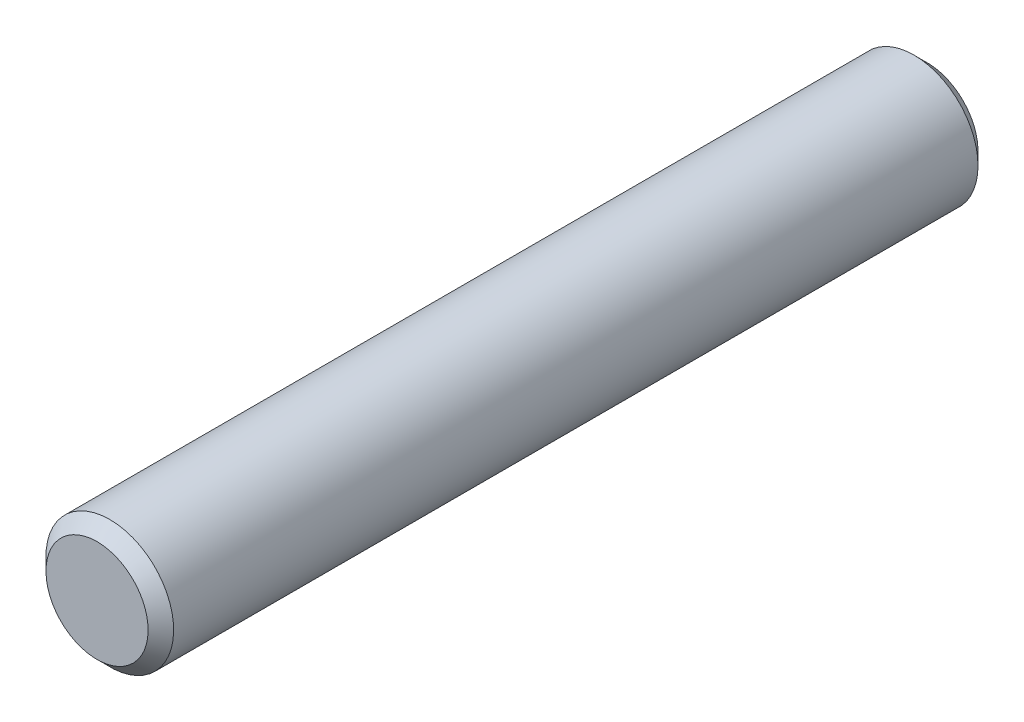
ISO-10303-21;
HEADER;
FILE_DESCRIPTION(('STEP AP214'),'2;1');
FILE_NAME('part.step','',(''),(''),'','','');
FILE_SCHEMA(('AUTOMOTIVE_DESIGN { 1 0 10303 214 1 1 1 1 }'));
ENDSEC;
DATA;
#1=APPLICATION_CONTEXT('core data for automotive mechanical design processes');
#2=APPLICATION_PROTOCOL_DEFINITION('international standard','automotive_design',2000,#1);
#3=PRODUCT_CONTEXT('',#1,'mechanical');
#4=PRODUCT('Part','Part','',(#3));
#5=PRODUCT_RELATED_PRODUCT_CATEGORY('part','',(#4));
#6=PRODUCT_DEFINITION_FORMATION('','',#4);
#7=PRODUCT_DEFINITION_CONTEXT('part definition',#1,'design');
#8=PRODUCT_DEFINITION('design','',#6,#7);
#9=PRODUCT_DEFINITION_SHAPE('','',#8);
#10=(LENGTH_UNIT() NAMED_UNIT(*) SI_UNIT(.MILLI.,.METRE.));
#11=(NAMED_UNIT(*) PLANE_ANGLE_UNIT() SI_UNIT($,.RADIAN.));
#12=(NAMED_UNIT(*) SI_UNIT($,.STERADIAN.) SOLID_ANGLE_UNIT());
#13=UNCERTAINTY_MEASURE_WITH_UNIT(LENGTH_MEASURE(1.E-05),#10,'distance_accuracy_value','');
#14=(GEOMETRIC_REPRESENTATION_CONTEXT(3) GLOBAL_UNCERTAINTY_ASSIGNED_CONTEXT((#13)) GLOBAL_UNIT_ASSIGNED_CONTEXT((#10,
#11,#12)) REPRESENTATION_CONTEXT('',''));
#15=CARTESIAN_POINT('',(0.,0.,0.));
#16=DIRECTION('',(0.,0.,1.));
#17=DIRECTION('',(1.,0.,0.));
#18=AXIS2_PLACEMENT_3D('',#15,#16,#17);
#19=CARTESIAN_POINT('',(0.,0.,13.));
#20=DIRECTION('',(0.,0.,1.));
#21=DIRECTION('',(0.,-1.,0.));
#22=AXIS2_PLACEMENT_3D('',#19,#20,#21);
#23=PLANE('',#22);
#24=CARTESIAN_POINT('',(0.,0.,12.9999999999768));
#25=DIRECTION('',(0.,0.,-1.));
#26=DIRECTION('',(0.,1.,0.));
#27=AXIS2_PLACEMENT_3D('',#24,#25,#26);
#28=CIRCLE('',#27,0.800000000026557);
#29=CARTESIAN_POINT('',(0.,0.800000000026563,12.9999999999768));
#30=VERTEX_POINT('',#29);
#31=EDGE_CURVE('E19',#30,#30,#28,.T.);
#32=ORIENTED_EDGE('',*,*,#31,.F.);
#33=EDGE_LOOP('',(#32));
#34=FACE_BOUND('',#33,.T.);
#35=ADVANCED_FACE('F16',(#34),#23,.T.);
#36=CARTESIAN_POINT('',(0.,0.,0.));
#37=DIRECTION('',(0.,0.,1.));
#38=DIRECTION('',(0.,-1.,0.));
#39=AXIS2_PLACEMENT_3D('',#36,#37,#38);
#40=PLANE('',#39);
#41=CARTESIAN_POINT('',(0.,0.,5.68434730709166E-11));
#42=DIRECTION('',(0.,0.,1.));
#43=DIRECTION('',(0.,-1.,0.));
#44=AXIS2_PLACEMENT_3D('',#41,#42,#43);
#45=CIRCLE('',#44,0.799999999969714);
#46=CARTESIAN_POINT('',(0.,-0.799999999969714,5.68437549634815E-11));
#47=VERTEX_POINT('',#46);
#48=EDGE_CURVE('E28',#47,#47,#45,.T.);
#49=ORIENTED_EDGE('',*,*,#48,.F.);
#50=EDGE_LOOP('',(#49));
#51=FACE_BOUND('',#50,.T.);
#52=ADVANCED_FACE('F39',(#51),#40,.F.);
#53=CARTESIAN_POINT('',(0.,0.,12.800000000027));
#54=DIRECTION('',(0.,0.,-1.));
#55=DIRECTION('',(0.,1.,0.));
#56=AXIS2_PLACEMENT_3D('',#53,#54,#55);
#57=CONICAL_SURFACE('',#56,0.999999999976353,0.785398163397448);
#58=CARTESIAN_POINT('',(0.,0.,12.8));
#59=DIRECTION('',(0.,0.,-1.));
#60=DIRECTION('',(0.,1.,0.));
#61=AXIS2_PLACEMENT_3D('',#58,#59,#60);
#62=CIRCLE('',#61,1.00000000000001);
#63=CARTESIAN_POINT('',(0.,1.00000000000001,12.8));
#64=VERTEX_POINT('',#63);
#65=EDGE_CURVE('E23',#64,#64,#62,.T.);
#66=ORIENTED_EDGE('',*,*,#65,.F.);
#67=EDGE_LOOP('',(#66));
#68=FACE_BOUND('',#67,.T.);
#69=ORIENTED_EDGE('',*,*,#31,.T.);
#70=EDGE_LOOP('',(#69));
#71=FACE_BOUND('',#70,.T.);
#72=ADVANCED_FACE('F36',(#68,#71),#57,.T.);
#73=CARTESIAN_POINT('',(0.,0.,0.199999999949796));
#74=DIRECTION('',(0.,0.,1.));
#75=DIRECTION('',(0.,-1.,0.));
#76=AXIS2_PLACEMENT_3D('',#73,#74,#75);
#77=CONICAL_SURFACE('',#76,0.999999999862666,0.785398163397448);
#78=CARTESIAN_POINT('',(0.,0.,0.200000000000013));
#79=DIRECTION('',(0.,0.,-1.));
#80=DIRECTION('',(0.,1.,0.));
#81=AXIS2_PLACEMENT_3D('',#78,#79,#80);
#82=CIRCLE('',#81,1.00000000000001);
#83=CARTESIAN_POINT('',(0.,1.00000000000001,0.200000000000012));
#84=VERTEX_POINT('',#83);
#85=EDGE_CURVE('E10',#84,#84,#82,.F.);
#86=ORIENTED_EDGE('',*,*,#85,.F.);
#87=EDGE_LOOP('',(#86));
#88=FACE_BOUND('',#87,.T.);
#89=ORIENTED_EDGE('',*,*,#48,.T.);
#90=EDGE_LOOP('',(#89));
#91=FACE_BOUND('',#90,.T.);
#92=ADVANCED_FACE('F46',(#88,#91),#77,.T.);
#93=CARTESIAN_POINT('',(0.,0.,13.));
#94=DIRECTION('',(0.,0.,-1.));
#95=DIRECTION('',(0.,1.,0.));
#96=AXIS2_PLACEMENT_3D('',#93,#94,#95);
#97=CYLINDRICAL_SURFACE('',#96,1.00000000000001);
#98=ORIENTED_EDGE('',*,*,#85,.T.);
#99=EDGE_LOOP('',(#98));
#100=FACE_BOUND('',#99,.T.);
#101=ORIENTED_EDGE('',*,*,#65,.T.);
#102=EDGE_LOOP('',(#101));
#103=FACE_BOUND('',#102,.T.);
#104=ADVANCED_FACE('F44',(#100,#103),#97,.T.);
#105=CLOSED_SHELL('',(#35,#52,#72,#92,#104));
#106=MANIFOLD_SOLID_BREP('B1',#105);
#107=ADVANCED_BREP_SHAPE_REPRESENTATION('',(#18,#106),#14);
#108=SHAPE_DEFINITION_REPRESENTATION(#9,#107);
ENDSEC;
END-ISO-10303-21;
